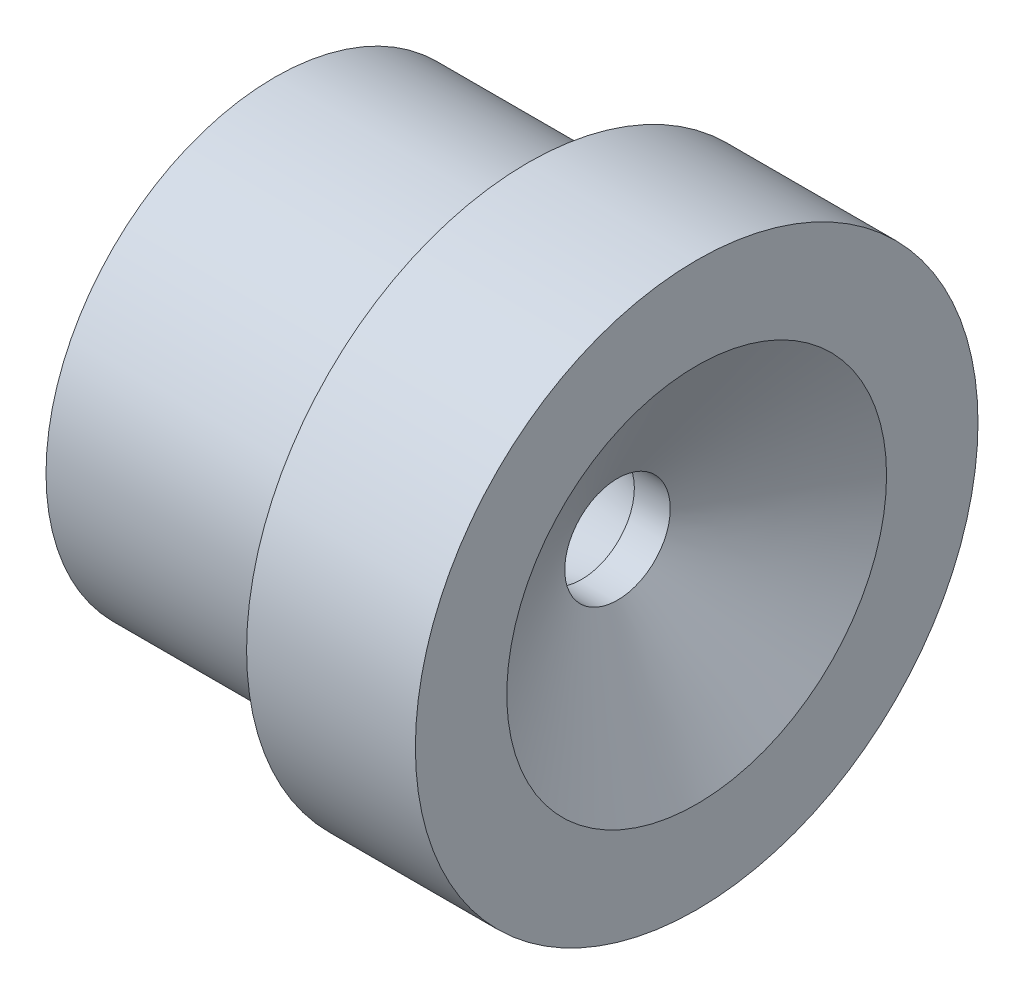
ISO-10303-21;
HEADER;
FILE_DESCRIPTION(('STEP AP214'),'2;1');
FILE_NAME('part.step','',(''),(''),'','','');
FILE_SCHEMA(('AUTOMOTIVE_DESIGN { 1 0 10303 214 1 1 1 1 }'));
ENDSEC;
DATA;
#1=APPLICATION_CONTEXT('core data for automotive mechanical design processes');
#2=APPLICATION_PROTOCOL_DEFINITION('international standard','automotive_design',2000,#1);
#3=PRODUCT_CONTEXT('',#1,'mechanical');
#4=PRODUCT('Part','Part','',(#3));
#5=PRODUCT_RELATED_PRODUCT_CATEGORY('part','',(#4));
#6=PRODUCT_DEFINITION_FORMATION('','',#4);
#7=PRODUCT_DEFINITION_CONTEXT('part definition',#1,'design');
#8=PRODUCT_DEFINITION('design','',#6,#7);
#9=PRODUCT_DEFINITION_SHAPE('','',#8);
#10=(LENGTH_UNIT() NAMED_UNIT(*) SI_UNIT(.MILLI.,.METRE.));
#11=(NAMED_UNIT(*) PLANE_ANGLE_UNIT() SI_UNIT($,.RADIAN.));
#12=(NAMED_UNIT(*) SI_UNIT($,.STERADIAN.) SOLID_ANGLE_UNIT());
#13=UNCERTAINTY_MEASURE_WITH_UNIT(LENGTH_MEASURE(1.E-05),#10,'distance_accuracy_value','');
#14=(GEOMETRIC_REPRESENTATION_CONTEXT(3) GLOBAL_UNCERTAINTY_ASSIGNED_CONTEXT((#13)) GLOBAL_UNIT_ASSIGNED_CONTEXT((#10,
#11,#12)) REPRESENTATION_CONTEXT('',''));
#15=CARTESIAN_POINT('',(0.,0.,0.));
#16=DIRECTION('',(0.,0.,1.));
#17=DIRECTION('',(1.,0.,0.));
#18=AXIS2_PLACEMENT_3D('',#15,#16,#17);
#19=CARTESIAN_POINT('',(5.11872970120267,0.,-12.7));
#20=DIRECTION('',(1.,0.,0.));
#21=DIRECTION('',(0.,0.,-1.));
#22=AXIS2_PLACEMENT_3D('',#19,#20,#21);
#23=CYLINDRICAL_SURFACE('',#22,12.7);
#24=CARTESIAN_POINT('',(0.,0.,-12.7));
#25=DIRECTION('',(1.,0.,0.));
#26=DIRECTION('',(0.,0.,-1.));
#27=AXIS2_PLACEMENT_3D('',#24,#25,#26);
#28=CIRCLE('',#27,12.7);
#29=CARTESIAN_POINT('',(0.,0.,-25.4));
#30=VERTEX_POINT('',#29);
#31=EDGE_CURVE('E11',#30,#30,#28,.T.);
#32=ORIENTED_EDGE('',*,*,#31,.F.);
#33=EDGE_LOOP('',(#32));
#34=FACE_BOUND('',#33,.T.);
#35=CARTESIAN_POINT('',(-7.62,0.,-12.7));
#36=DIRECTION('',(1.,0.,0.));
#37=DIRECTION('',(0.,0.,-1.));
#38=AXIS2_PLACEMENT_3D('',#35,#36,#37);
#39=CIRCLE('',#38,12.7);
#40=CARTESIAN_POINT('',(-7.62000000000001,0.,-25.4));
#41=VERTEX_POINT('',#40);
#42=EDGE_CURVE('E67',#41,#41,#39,.T.);
#43=ORIENTED_EDGE('',*,*,#42,.T.);
#44=EDGE_LOOP('',(#43));
#45=FACE_BOUND('',#44,.T.);
#46=ADVANCED_FACE('F41',(#34,#45),#23,.T.);
#47=CARTESIAN_POINT('',(0.,0.,0.));
#48=DIRECTION('',(-1.,0.,0.));
#49=DIRECTION('',(0.,0.,1.));
#50=AXIS2_PLACEMENT_3D('',#47,#48,#49);
#51=PLANE('',#50);
#52=CARTESIAN_POINT('',(0.,0.,-12.7));
#53=DIRECTION('',(1.,0.,0.));
#54=DIRECTION('',(0.,0.,-1.));
#55=AXIS2_PLACEMENT_3D('',#52,#53,#54);
#56=CIRCLE('',#55,8.5725);
#57=CARTESIAN_POINT('',(0.,0.,-21.2725));
#58=VERTEX_POINT('',#57);
#59=EDGE_CURVE('E50',#58,#58,#56,.T.);
#60=ORIENTED_EDGE('',*,*,#59,.F.);
#61=EDGE_LOOP('',(#60));
#62=FACE_BOUND('',#61,.T.);
#63=ORIENTED_EDGE('',*,*,#31,.T.);
#64=EDGE_LOOP('',(#63));
#65=FACE_BOUND('',#64,.T.);
#66=ADVANCED_FACE('F106',(#62,#65),#51,.F.);
#67=CARTESIAN_POINT('',(0.,0.,-12.7));
#68=DIRECTION('',(1.,0.,0.));
#69=DIRECTION('',(0.,0.,-1.));
#70=AXIS2_PLACEMENT_3D('',#67,#68,#69);
#71=CONICAL_SURFACE('',#70,8.5725,1.0471975511966);
#72=CARTESIAN_POINT('',(-3.57451985412025,0.,-12.7));
#73=DIRECTION('',(1.,0.,0.));
#74=DIRECTION('',(0.,0.,-1.));
#75=AXIS2_PLACEMENT_3D('',#72,#73,#74);
#76=CIRCLE('',#75,2.38125);
#77=CARTESIAN_POINT('',(-3.57451985412025,0.,-15.08125));
#78=VERTEX_POINT('',#77);
#79=EDGE_CURVE('E51',#78,#78,#76,.T.);
#80=CARTESIAN_POINT('',(-3.57451985412025,0.,-15.08125));
#81=CARTESIAN_POINT('',(-3.5372852723065,0.,-15.1457421875));
#82=CARTESIAN_POINT('',(-3.50005069049275,0.,-15.210234375));
#83=CARTESIAN_POINT('',(-3.42558152686524,0.,-15.33921875));
#84=CARTESIAN_POINT('',(-3.38834694505149,0.,-15.4037109375));
#85=CARTESIAN_POINT('',(-3.31387778142399,0.,-15.5326953125));
#86=CARTESIAN_POINT('',(-3.27664319961023,0.,-15.5971875));
#87=CARTESIAN_POINT('',(-3.20217403598273,0.,-15.726171875));
#88=CARTESIAN_POINT('',(-3.16493945416897,0.,-15.7906640625));
#89=CARTESIAN_POINT('',(-3.09047029054147,0.,-15.9196484375));
#90=CARTESIAN_POINT('',(-3.05323570872772,0.,-15.984140625));
#91=CARTESIAN_POINT('',(-2.97876654510021,0.,-16.113125));
#92=CARTESIAN_POINT('',(-2.94153196328646,0.,-16.1776171875));
#93=CARTESIAN_POINT('',(-2.86706279965895,0.,-16.3066015625));
#94=CARTESIAN_POINT('',(-2.8298282178452,0.,-16.37109375));
#95=CARTESIAN_POINT('',(-2.7553590542177,0.,-16.500078125));
#96=CARTESIAN_POINT('',(-2.71812447240394,0.,-16.5645703125));
#97=CARTESIAN_POINT('',(-2.64365530877644,0.,-16.6935546875));
#98=CARTESIAN_POINT('',(-2.60642072696269,0.,-16.758046875));
#99=CARTESIAN_POINT('',(-2.53195156333518,0.,-16.88703125));
#100=CARTESIAN_POINT('',(-2.49471698152143,0.,-16.9515234375));
#101=CARTESIAN_POINT('',(-2.42024781789392,0.,-17.0805078125));
#102=CARTESIAN_POINT('',(-2.38301323608017,0.,-17.145));
#103=CARTESIAN_POINT('',(-2.30854407245267,0.,-17.273984375));
#104=CARTESIAN_POINT('',(-2.27130949063891,0.,-17.3384765625));
#105=CARTESIAN_POINT('',(-2.19684032701141,0.,-17.4674609375));
#106=CARTESIAN_POINT('',(-2.15960574519766,0.,-17.531953125));
#107=CARTESIAN_POINT('',(-2.08513658157015,0.,-17.6609375));
#108=CARTESIAN_POINT('',(-2.0479019997564,0.,-17.7254296875));
#109=CARTESIAN_POINT('',(-1.97343283612889,0.,-17.8544140625));
#110=CARTESIAN_POINT('',(-1.93619825431514,0.,-17.91890625));
#111=CARTESIAN_POINT('',(-1.86172909068764,0.,-18.047890625));
#112=CARTESIAN_POINT('',(-1.82449450887388,0.,-18.1123828125));
#113=CARTESIAN_POINT('',(-1.75002534524638,0.,-18.2413671875));
#114=CARTESIAN_POINT('',(-1.71279076343262,0.,-18.305859375));
#115=CARTESIAN_POINT('',(-1.63832159980512,0.,-18.43484375));
#116=CARTESIAN_POINT('',(-1.60108701799137,0.,-18.4993359375));
#117=CARTESIAN_POINT('',(-1.52661785436386,0.,-18.6283203125));
#118=CARTESIAN_POINT('',(-1.48938327255011,0.,-18.6928125));
#119=CARTESIAN_POINT('',(-1.4149141089226,0.,-18.821796875));
#120=CARTESIAN_POINT('',(-1.37767952710885,0.,-18.8862890625));
#121=CARTESIAN_POINT('',(-1.30321036348135,0.,-19.0152734375));
#122=CARTESIAN_POINT('',(-1.26597578166759,0.,-19.079765625));
#123=CARTESIAN_POINT('',(-1.19150661804009,0.,-19.20875));
#124=CARTESIAN_POINT('',(-1.15427203622634,0.,-19.2732421875));
#125=CARTESIAN_POINT('',(-1.07980287259883,0.,-19.4022265625));
#126=CARTESIAN_POINT('',(-1.04256829078508,0.,-19.46671875));
#127=CARTESIAN_POINT('',(-0.968099127157573,0.,-19.595703125));
#128=CARTESIAN_POINT('',(-0.930864545343819,0.,-19.6601953125));
#129=CARTESIAN_POINT('',(-0.856395381716314,0.,-19.7891796875));
#130=CARTESIAN_POINT('',(-0.819160799902563,0.,-19.853671875));
#131=CARTESIAN_POINT('',(-0.744691636275058,0.,-19.98265625));
#132=CARTESIAN_POINT('',(-0.707457054461304,0.,-20.0471484375));
#133=CARTESIAN_POINT('',(-0.632987890833799,0.,-20.1761328125));
#134=CARTESIAN_POINT('',(-0.595753309020047,0.,-20.240625));
#135=CARTESIAN_POINT('',(-0.521284145392542,0.,-20.369609375));
#136=CARTESIAN_POINT('',(-0.484049563578789,0.,-20.4341015625));
#137=CARTESIAN_POINT('',(-0.409580399951284,0.,-20.5630859375));
#138=CARTESIAN_POINT('',(-0.372345818137531,0.,-20.627578125));
#139=CARTESIAN_POINT('',(-0.297876654510026,0.,-20.7565625));
#140=CARTESIAN_POINT('',(-0.260642072696274,0.,-20.8210546875));
#141=CARTESIAN_POINT('',(-0.186172909068769,0.,-20.9500390625));
#142=CARTESIAN_POINT('',(-0.148938327255016,0.,-21.01453125));
#143=CARTESIAN_POINT('',(-0.0744691636275101,0.,-21.143515625));
#144=CARTESIAN_POINT('',(-0.0372345818137574,0.,-21.2080078125));
#145=CARTESIAN_POINT('',(0.,0.,-21.2725));
#146=B_SPLINE_CURVE_WITH_KNOTS('',3,(#80,#81,#82,#83,#84,#85,#86,#87,#88,#89,#90,#91,#92,#93,
#94,#95,#96,#97,#98,#99,#100,#101,#102,#103,#104,#105,#106,#107,#108,#109,#110,#111,#112,#113,
#114,#115,#116,#117,#118,#119,#120,#121,#122,#123,#124,#125,#126,#127,#128,#129,#130,#131,#132,
#133,#134,#135,#136,#137,#138,#139,#140,#141,#142,#143,#144,#145),.UNSPECIFIED.,.F.,.F.,(4,2,2,
2,2,2,2,2,2,2,2,2,2,2,2,2,2,2,2,2,2,2,2,2,2,2,2,2,2,2,2,2,4),(0.,0.223407490882516,
0.446814981765034,0.670222472647553,0.893629963530069,1.11703745441258,1.3404449452951,
1.56385243617762,1.78725992706014,2.01066741794265,2.23407490882517,2.45748239970768,
2.6808898905902,2.90429738147272,3.12770487235523,3.35111236323775,3.57451985412027,
3.79792734500278,4.0213348358853,4.24474232676782,4.46814981765034,4.69155730853285,
4.91496479941537,5.13837229029789,5.3617797811804,5.58518727206292,5.80859476294543,
6.03200225382795,6.25540974471047,6.47881723559298,6.7022247264755,6.92563221735802,
7.14903970824053),.UNSPECIFIED.);
#147=EDGE_CURVE('BSEAM101',#78,#58,#146,.T.);
#148=ORIENTED_EDGE('',*,*,#79,.F.);
#149=ORIENTED_EDGE('',*,*,#59,.T.);
#150=ORIENTED_EDGE('',*,*,#147,.T.);
#151=ORIENTED_EDGE('',*,*,#147,.F.);
#152=EDGE_LOOP('',(#148,#150,#149,#151));
#153=FACE_BOUND('',#152,.T.);
#154=ADVANCED_FACE('F101',(#153),#71,.F.);
#155=CARTESIAN_POINT('',(5.11872970120267,0.,-12.7));
#156=DIRECTION('',(1.,0.,0.));
#157=DIRECTION('',(0.,0.,-1.));
#158=AXIS2_PLACEMENT_3D('',#155,#156,#157);
#159=CYLINDRICAL_SURFACE('',#158,2.38125);
#160=CARTESIAN_POINT('',(-5.19503985412025,0.,-12.7));
#161=DIRECTION('',(1.,0.,0.));
#162=DIRECTION('',(0.,0.,-1.));
#163=AXIS2_PLACEMENT_3D('',#160,#161,#162);
#164=CIRCLE('',#163,2.38125);
#165=CARTESIAN_POINT('',(-5.19503985412025,0.,-15.08125));
#166=VERTEX_POINT('',#165);
#167=EDGE_CURVE('E54',#166,#166,#164,.T.);
#168=ORIENTED_EDGE('',*,*,#167,.F.);
#169=EDGE_LOOP('',(#168));
#170=FACE_BOUND('',#169,.T.);
#171=ORIENTED_EDGE('',*,*,#79,.T.);
#172=EDGE_LOOP('',(#171));
#173=FACE_BOUND('',#172,.T.);
#174=ADVANCED_FACE('F92',(#170,#173),#159,.F.);
#175=CARTESIAN_POINT('',(-5.19503985412025,0.,-12.7));
#176=DIRECTION('',(-1.,0.,0.));
#177=DIRECTION('',(0.,0.,1.));
#178=AXIS2_PLACEMENT_3D('',#175,#176,#177);
#179=CONICAL_SURFACE('',#178,2.38125,0.26179938779915);
#180=CARTESIAN_POINT('',(-19.05,0.,-12.7));
#181=DIRECTION('',(1.,0.,0.));
#182=DIRECTION('',(0.,0.,-1.));
#183=AXIS2_PLACEMENT_3D('',#180,#181,#182);
#184=CIRCLE('',#183,6.09367538225388);
#185=CARTESIAN_POINT('',(-19.05,0.,-18.7936753822539));
#186=VERTEX_POINT('',#185);
#187=EDGE_CURVE('E58',#186,#186,#184,.T.);
#188=ORIENTED_EDGE('',*,*,#187,.F.);
#189=EDGE_LOOP('',(#188));
#190=FACE_BOUND('',#189,.T.);
#191=ORIENTED_EDGE('',*,*,#167,.T.);
#192=EDGE_LOOP('',(#191));
#193=FACE_BOUND('',#192,.T.);
#194=ADVANCED_FACE('F90',(#190,#193),#179,.F.);
#195=CARTESIAN_POINT('',(-19.05,0.,-6.60632461774612));
#196=DIRECTION('',(1.,0.,0.));
#197=DIRECTION('',(0.,0.,-1.));
#198=AXIS2_PLACEMENT_3D('',#195,#196,#197);
#199=PLANE('',#198);
#200=CARTESIAN_POINT('',(-19.05,0.,-12.7));
#201=DIRECTION('',(1.,0.,0.));
#202=DIRECTION('',(0.,0.,-1.));
#203=AXIS2_PLACEMENT_3D('',#200,#201,#202);
#204=CIRCLE('',#203,10.3251);
#205=CARTESIAN_POINT('',(-19.05,0.,-23.0251));
#206=VERTEX_POINT('',#205);
#207=EDGE_CURVE('E62',#206,#206,#204,.T.);
#208=ORIENTED_EDGE('',*,*,#207,.F.);
#209=EDGE_LOOP('',(#208));
#210=FACE_BOUND('',#209,.T.);
#211=ORIENTED_EDGE('',*,*,#187,.T.);
#212=EDGE_LOOP('',(#211));
#213=FACE_BOUND('',#212,.T.);
#214=ADVANCED_FACE('F83',(#210,#213),#199,.F.);
#215=CARTESIAN_POINT('',(5.11872970120267,0.,-12.7));
#216=DIRECTION('',(1.,0.,0.));
#217=DIRECTION('',(0.,0.,-1.));
#218=AXIS2_PLACEMENT_3D('',#215,#216,#217);
#219=CYLINDRICAL_SURFACE('',#218,10.3251);
#220=CARTESIAN_POINT('',(-7.62,0.,-12.7));
#221=DIRECTION('',(1.,0.,0.));
#222=DIRECTION('',(0.,0.,-1.));
#223=AXIS2_PLACEMENT_3D('',#220,#221,#222);
#224=CIRCLE('',#223,10.3251);
#225=CARTESIAN_POINT('',(-7.62,0.,-23.0251));
#226=VERTEX_POINT('',#225);
#227=EDGE_CURVE('E66',#226,#226,#224,.T.);
#228=ORIENTED_EDGE('',*,*,#227,.F.);
#229=EDGE_LOOP('',(#228));
#230=FACE_BOUND('',#229,.T.);
#231=ORIENTED_EDGE('',*,*,#207,.T.);
#232=EDGE_LOOP('',(#231));
#233=FACE_BOUND('',#232,.T.);
#234=ADVANCED_FACE('F76',(#230,#233),#219,.T.);
#235=CARTESIAN_POINT('',(-7.62,0.,-2.3749));
#236=DIRECTION('',(1.,0.,0.));
#237=DIRECTION('',(0.,0.,-1.));
#238=AXIS2_PLACEMENT_3D('',#235,#236,#237);
#239=PLANE('',#238);
#240=ORIENTED_EDGE('',*,*,#42,.F.);
#241=EDGE_LOOP('',(#240));
#242=FACE_BOUND('',#241,.T.);
#243=ORIENTED_EDGE('',*,*,#227,.T.);
#244=EDGE_LOOP('',(#243));
#245=FACE_BOUND('',#244,.T.);
#246=ADVANCED_FACE('F74',(#242,#245),#239,.F.);
#247=CLOSED_SHELL('',(#46,#66,#154,#174,#194,#214,#234,#246));
#248=MANIFOLD_SOLID_BREP('B2',#247);
#249=ADVANCED_BREP_SHAPE_REPRESENTATION('',(#18,#248),#14);
#250=SHAPE_DEFINITION_REPRESENTATION(#9,#249);
ENDSEC;
END-ISO-10303-21;
